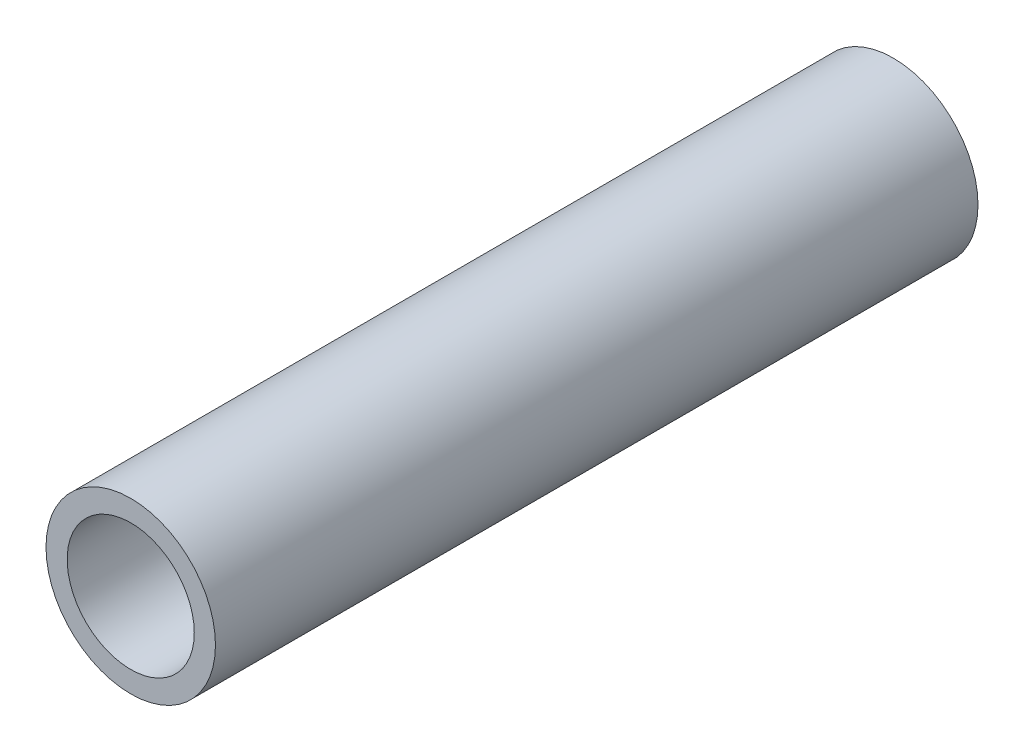
ISO-10303-21;
HEADER;
FILE_DESCRIPTION(('STEP AP214'),'2;1');
FILE_NAME('part.step','',(''),(''),'','','');
FILE_SCHEMA(('AUTOMOTIVE_DESIGN { 1 0 10303 214 1 1 1 1 }'));
ENDSEC;
DATA;
#1=APPLICATION_CONTEXT('core data for automotive mechanical design processes');
#2=APPLICATION_PROTOCOL_DEFINITION('international standard','automotive_design',2000,#1);
#3=PRODUCT_CONTEXT('',#1,'mechanical');
#4=PRODUCT('Part','Part','',(#3));
#5=PRODUCT_RELATED_PRODUCT_CATEGORY('part','',(#4));
#6=PRODUCT_DEFINITION_FORMATION('','',#4);
#7=PRODUCT_DEFINITION_CONTEXT('part definition',#1,'design');
#8=PRODUCT_DEFINITION('design','',#6,#7);
#9=PRODUCT_DEFINITION_SHAPE('','',#8);
#10=(LENGTH_UNIT() NAMED_UNIT(*) SI_UNIT(.MILLI.,.METRE.));
#11=(NAMED_UNIT(*) PLANE_ANGLE_UNIT() SI_UNIT($,.RADIAN.));
#12=(NAMED_UNIT(*) SI_UNIT($,.STERADIAN.) SOLID_ANGLE_UNIT());
#13=UNCERTAINTY_MEASURE_WITH_UNIT(LENGTH_MEASURE(1.E-05),#10,'distance_accuracy_value','');
#14=(GEOMETRIC_REPRESENTATION_CONTEXT(3) GLOBAL_UNCERTAINTY_ASSIGNED_CONTEXT((#13)) GLOBAL_UNIT_ASSIGNED_CONTEXT((#10,
#11,#12)) REPRESENTATION_CONTEXT('',''));
#15=CARTESIAN_POINT('',(0.,0.,0.));
#16=DIRECTION('',(0.,0.,1.));
#17=DIRECTION('',(1.,0.,0.));
#18=AXIS2_PLACEMENT_3D('',#15,#16,#17);
#19=CARTESIAN_POINT('',(0.,0.,180.));
#20=DIRECTION('',(0.,0.,-1.));
#21=DIRECTION('',(-1.,0.,0.));
#22=AXIS2_PLACEMENT_3D('',#19,#20,#21);
#23=CYLINDRICAL_SURFACE('',#22,20.);
#24=CARTESIAN_POINT('',(0.,0.,180.));
#25=DIRECTION('',(0.,0.,1.));
#26=DIRECTION('',(1.,0.,0.));
#27=AXIS2_PLACEMENT_3D('',#24,#25,#26);
#28=CIRCLE('',#27,20.);
#29=CARTESIAN_POINT('',(-20.,0.,180.));
#30=VERTEX_POINT('',#29);
#31=EDGE_CURVE('E10',#30,#30,#28,.T.);
#32=CARTESIAN_POINT('',(0.,0.,0.));
#33=DIRECTION('',(0.,0.,1.));
#34=DIRECTION('',(1.,0.,0.));
#35=AXIS2_PLACEMENT_3D('',#32,#33,#34);
#36=CIRCLE('',#35,20.);
#37=CARTESIAN_POINT('',(-20.,0.,0.));
#38=VERTEX_POINT('',#37);
#39=EDGE_CURVE('E34',#38,#38,#36,.T.);
#40=CARTESIAN_POINT('',(-20.,0.,180.));
#41=CARTESIAN_POINT('',(-20.,0.,178.125));
#42=CARTESIAN_POINT('',(-20.,0.,176.25));
#43=CARTESIAN_POINT('',(-20.,0.,172.5));
#44=CARTESIAN_POINT('',(-20.,0.,170.625));
#45=CARTESIAN_POINT('',(-20.,0.,166.875));
#46=CARTESIAN_POINT('',(-20.,0.,165.));
#47=CARTESIAN_POINT('',(-20.,0.,161.25));
#48=CARTESIAN_POINT('',(-20.,0.,159.375));
#49=CARTESIAN_POINT('',(-20.,0.,155.625));
#50=CARTESIAN_POINT('',(-20.,0.,153.75));
#51=CARTESIAN_POINT('',(-20.,0.,150.));
#52=CARTESIAN_POINT('',(-20.,0.,148.125));
#53=CARTESIAN_POINT('',(-20.,0.,144.375));
#54=CARTESIAN_POINT('',(-20.,0.,142.5));
#55=CARTESIAN_POINT('',(-20.,0.,138.75));
#56=CARTESIAN_POINT('',(-20.,0.,136.875));
#57=CARTESIAN_POINT('',(-20.,0.,133.125));
#58=CARTESIAN_POINT('',(-20.,0.,131.25));
#59=CARTESIAN_POINT('',(-20.,0.,127.5));
#60=CARTESIAN_POINT('',(-20.,0.,125.625));
#61=CARTESIAN_POINT('',(-20.,0.,121.875));
#62=CARTESIAN_POINT('',(-20.,0.,120.));
#63=CARTESIAN_POINT('',(-20.,0.,116.25));
#64=CARTESIAN_POINT('',(-20.,0.,114.375));
#65=CARTESIAN_POINT('',(-20.,0.,110.625));
#66=CARTESIAN_POINT('',(-20.,0.,108.75));
#67=CARTESIAN_POINT('',(-20.,0.,105.));
#68=CARTESIAN_POINT('',(-20.,0.,103.125));
#69=CARTESIAN_POINT('',(-20.,0.,99.375));
#70=CARTESIAN_POINT('',(-20.,0.,97.5));
#71=CARTESIAN_POINT('',(-20.,0.,93.75));
#72=CARTESIAN_POINT('',(-20.,0.,91.875));
#73=CARTESIAN_POINT('',(-20.,0.,88.125));
#74=CARTESIAN_POINT('',(-20.,0.,86.25));
#75=CARTESIAN_POINT('',(-20.,0.,82.5));
#76=CARTESIAN_POINT('',(-20.,0.,80.625));
#77=CARTESIAN_POINT('',(-20.,0.,76.875));
#78=CARTESIAN_POINT('',(-20.,0.,75.));
#79=CARTESIAN_POINT('',(-20.,0.,71.25));
#80=CARTESIAN_POINT('',(-20.,0.,69.375));
#81=CARTESIAN_POINT('',(-20.,0.,65.625));
#82=CARTESIAN_POINT('',(-20.,0.,63.75));
#83=CARTESIAN_POINT('',(-20.,0.,60.));
#84=CARTESIAN_POINT('',(-20.,0.,58.125));
#85=CARTESIAN_POINT('',(-20.,0.,54.375));
#86=CARTESIAN_POINT('',(-20.,0.,52.5));
#87=CARTESIAN_POINT('',(-20.,0.,48.75));
#88=CARTESIAN_POINT('',(-20.,0.,46.875));
#89=CARTESIAN_POINT('',(-20.,0.,43.125));
#90=CARTESIAN_POINT('',(-20.,0.,41.25));
#91=CARTESIAN_POINT('',(-20.,0.,37.5));
#92=CARTESIAN_POINT('',(-20.,0.,35.625));
#93=CARTESIAN_POINT('',(-20.,0.,31.875));
#94=CARTESIAN_POINT('',(-20.,0.,30.));
#95=CARTESIAN_POINT('',(-20.,0.,26.25));
#96=CARTESIAN_POINT('',(-20.,0.,24.375));
#97=CARTESIAN_POINT('',(-20.,0.,20.625));
#98=CARTESIAN_POINT('',(-20.,0.,18.75));
#99=CARTESIAN_POINT('',(-20.,0.,15.));
#100=CARTESIAN_POINT('',(-20.,0.,13.125));
#101=CARTESIAN_POINT('',(-20.,0.,9.37499999999998));
#102=CARTESIAN_POINT('',(-20.,0.,7.49999999999997));
#103=CARTESIAN_POINT('',(-20.,0.,3.74999999999997));
#104=CARTESIAN_POINT('',(-20.,0.,1.87499999999997));
#105=CARTESIAN_POINT('',(-20.,0.,0.));
#106=B_SPLINE_CURVE_WITH_KNOTS('',3,(#40,#41,#42,#43,#44,#45,#46,#47,#48,#49,#50,#51,#52,#53,
#54,#55,#56,#57,#58,#59,#60,#61,#62,#63,#64,#65,#66,#67,#68,#69,#70,#71,#72,#73,#74,#75,#76,#77,
#78,#79,#80,#81,#82,#83,#84,#85,#86,#87,#88,#89,#90,#91,#92,#93,#94,#95,#96,#97,#98,#99,#100,
#101,#102,#103,#104,#105),.UNSPECIFIED.,.F.,.F.,(4,2,2,2,2,2,2,2,2,2,2,2,2,2,2,2,2,2,2,2,2,2,2,
2,2,2,2,2,2,2,2,2,4),(0.,5.62500000000002,11.25,16.875,22.5,28.125,33.75,39.375,45.,50.625,
56.25,61.875,67.5,73.125,78.75,84.375,90.,95.625,101.25,106.875,112.5,118.125,123.75,129.375,
135.,140.625,146.25,151.875,157.5,163.125,168.75,174.375,180.),.UNSPECIFIED.);
#107=EDGE_CURVE('BSEAM31',#30,#38,#106,.T.);
#108=ORIENTED_EDGE('',*,*,#31,.F.);
#109=ORIENTED_EDGE('',*,*,#39,.T.);
#110=ORIENTED_EDGE('',*,*,#107,.T.);
#111=ORIENTED_EDGE('',*,*,#107,.F.);
#112=EDGE_LOOP('',(#108,#110,#109,#111));
#113=FACE_BOUND('',#112,.T.);
#114=ADVANCED_FACE('F31',(#113),#23,.T.);
#115=CARTESIAN_POINT('',(0.,0.,180.));
#116=DIRECTION('',(0.,0.,1.));
#117=DIRECTION('',(1.,0.,0.));
#118=AXIS2_PLACEMENT_3D('',#115,#116,#117);
#119=PLANE('',#118);
#120=CARTESIAN_POINT('',(0.,0.,180.));
#121=DIRECTION('',(0.,0.,1.));
#122=DIRECTION('',(1.,0.,0.));
#123=AXIS2_PLACEMENT_3D('',#120,#121,#122);
#124=CIRCLE('',#123,15.);
#125=CARTESIAN_POINT('',(15.,0.,180.));
#126=VERTEX_POINT('',#125);
#127=EDGE_CURVE('E43',#126,#126,#124,.T.);
#128=ORIENTED_EDGE('',*,*,#127,.F.);
#129=EDGE_LOOP('',(#128));
#130=FACE_BOUND('',#129,.T.);
#131=ORIENTED_EDGE('',*,*,#31,.T.);
#132=EDGE_LOOP('',(#131));
#133=FACE_BOUND('',#132,.T.);
#134=ADVANCED_FACE('F58',(#130,#133),#119,.T.);
#135=CARTESIAN_POINT('',(0.,0.,0.));
#136=DIRECTION('',(0.,0.,1.));
#137=DIRECTION('',(1.,0.,0.));
#138=AXIS2_PLACEMENT_3D('',#135,#136,#137);
#139=PLANE('',#138);
#140=CARTESIAN_POINT('',(0.,0.,0.));
#141=DIRECTION('',(0.,0.,1.));
#142=DIRECTION('',(1.,0.,0.));
#143=AXIS2_PLACEMENT_3D('',#140,#141,#142);
#144=CIRCLE('',#143,15.);
#145=CARTESIAN_POINT('',(15.,0.,0.));
#146=VERTEX_POINT('',#145);
#147=EDGE_CURVE('E41',#146,#146,#144,.T.);
#148=ORIENTED_EDGE('',*,*,#147,.T.);
#149=EDGE_LOOP('',(#148));
#150=FACE_BOUND('',#149,.T.);
#151=ORIENTED_EDGE('',*,*,#39,.F.);
#152=EDGE_LOOP('',(#151));
#153=FACE_BOUND('',#152,.T.);
#154=ADVANCED_FACE('F49',(#150,#153),#139,.F.);
#155=CARTESIAN_POINT('',(0.,0.,0.));
#156=DIRECTION('',(0.,0.,1.));
#157=DIRECTION('',(1.,0.,0.));
#158=AXIS2_PLACEMENT_3D('',#155,#156,#157);
#159=CYLINDRICAL_SURFACE('',#158,15.);
#160=CARTESIAN_POINT('',(15.,0.,0.));
#161=CARTESIAN_POINT('',(15.,0.,1.875));
#162=CARTESIAN_POINT('',(15.,0.,3.75));
#163=CARTESIAN_POINT('',(15.,0.,7.5));
#164=CARTESIAN_POINT('',(15.,0.,9.375));
#165=CARTESIAN_POINT('',(15.,0.,13.125));
#166=CARTESIAN_POINT('',(15.,0.,15.));
#167=CARTESIAN_POINT('',(15.,0.,18.75));
#168=CARTESIAN_POINT('',(15.,0.,20.625));
#169=CARTESIAN_POINT('',(15.,0.,24.375));
#170=CARTESIAN_POINT('',(15.,0.,26.25));
#171=CARTESIAN_POINT('',(15.,0.,30.));
#172=CARTESIAN_POINT('',(15.,0.,31.875));
#173=CARTESIAN_POINT('',(15.,0.,35.625));
#174=CARTESIAN_POINT('',(15.,0.,37.5));
#175=CARTESIAN_POINT('',(15.,0.,41.25));
#176=CARTESIAN_POINT('',(15.,0.,43.125));
#177=CARTESIAN_POINT('',(15.,0.,46.875));
#178=CARTESIAN_POINT('',(15.,0.,48.75));
#179=CARTESIAN_POINT('',(15.,0.,52.5));
#180=CARTESIAN_POINT('',(15.,0.,54.375));
#181=CARTESIAN_POINT('',(15.,0.,58.125));
#182=CARTESIAN_POINT('',(15.,0.,60.));
#183=CARTESIAN_POINT('',(15.,0.,63.75));
#184=CARTESIAN_POINT('',(15.,0.,65.625));
#185=CARTESIAN_POINT('',(15.,0.,69.375));
#186=CARTESIAN_POINT('',(15.,0.,71.25));
#187=CARTESIAN_POINT('',(15.,0.,75.));
#188=CARTESIAN_POINT('',(15.,0.,76.875));
#189=CARTESIAN_POINT('',(15.,0.,80.625));
#190=CARTESIAN_POINT('',(15.,0.,82.5));
#191=CARTESIAN_POINT('',(15.,0.,86.25));
#192=CARTESIAN_POINT('',(15.,0.,88.125));
#193=CARTESIAN_POINT('',(15.,0.,91.875));
#194=CARTESIAN_POINT('',(15.,0.,93.75));
#195=CARTESIAN_POINT('',(15.,0.,97.5));
#196=CARTESIAN_POINT('',(15.,0.,99.375));
#197=CARTESIAN_POINT('',(15.,0.,103.125));
#198=CARTESIAN_POINT('',(15.,0.,105.));
#199=CARTESIAN_POINT('',(15.,0.,108.75));
#200=CARTESIAN_POINT('',(15.,0.,110.625));
#201=CARTESIAN_POINT('',(15.,0.,114.375));
#202=CARTESIAN_POINT('',(15.,0.,116.25));
#203=CARTESIAN_POINT('',(15.,0.,120.));
#204=CARTESIAN_POINT('',(15.,0.,121.875));
#205=CARTESIAN_POINT('',(15.,0.,125.625));
#206=CARTESIAN_POINT('',(15.,0.,127.5));
#207=CARTESIAN_POINT('',(15.,0.,131.25));
#208=CARTESIAN_POINT('',(15.,0.,133.125));
#209=CARTESIAN_POINT('',(15.,0.,136.875));
#210=CARTESIAN_POINT('',(15.,0.,138.75));
#211=CARTESIAN_POINT('',(15.,0.,142.5));
#212=CARTESIAN_POINT('',(15.,0.,144.375));
#213=CARTESIAN_POINT('',(15.,0.,148.125));
#214=CARTESIAN_POINT('',(15.,0.,150.));
#215=CARTESIAN_POINT('',(15.,0.,153.75));
#216=CARTESIAN_POINT('',(15.,0.,155.625));
#217=CARTESIAN_POINT('',(15.,0.,159.375));
#218=CARTESIAN_POINT('',(15.,0.,161.25));
#219=CARTESIAN_POINT('',(15.,0.,165.));
#220=CARTESIAN_POINT('',(15.,0.,166.875));
#221=CARTESIAN_POINT('',(15.,0.,170.625));
#222=CARTESIAN_POINT('',(15.,0.,172.5));
#223=CARTESIAN_POINT('',(15.,0.,176.25));
#224=CARTESIAN_POINT('',(15.,0.,178.125));
#225=CARTESIAN_POINT('',(15.,0.,180.));
#226=B_SPLINE_CURVE_WITH_KNOTS('',3,(#160,#161,#162,#163,#164,#165,#166,#167,#168,#169,#170,
#171,#172,#173,#174,#175,#176,#177,#178,#179,#180,#181,#182,#183,#184,#185,#186,#187,#188,#189,
#190,#191,#192,#193,#194,#195,#196,#197,#198,#199,#200,#201,#202,#203,#204,#205,#206,#207,#208,
#209,#210,#211,#212,#213,#214,#215,#216,#217,#218,#219,#220,#221,#222,#223,#224,#225),
.UNSPECIFIED.,.F.,.F.,(4,2,2,2,2,2,2,2,2,2,2,2,2,2,2,2,2,2,2,2,2,2,2,2,2,2,2,2,2,2,2,2,4),(0.,
5.625,11.25,16.875,22.5,28.125,33.75,39.375,45.,50.625,56.25,61.875,67.5,73.125,78.75,84.375,
90.,95.625,101.25,106.875,112.5,118.125,123.75,129.375,135.,140.625,146.25,151.875,157.5,
163.125,168.75,174.375,180.),.UNSPECIFIED.);
#227=EDGE_CURVE('BSEAM52',#146,#126,#226,.T.);
#228=ORIENTED_EDGE('',*,*,#147,.F.);
#229=ORIENTED_EDGE('',*,*,#127,.T.);
#230=ORIENTED_EDGE('',*,*,#227,.T.);
#231=ORIENTED_EDGE('',*,*,#227,.F.);
#232=EDGE_LOOP('',(#228,#230,#229,#231));
#233=FACE_BOUND('',#232,.T.);
#234=ADVANCED_FACE('F52',(#233),#159,.F.);
#235=CLOSED_SHELL('',(#114,#134,#154,#234));
#236=MANIFOLD_SOLID_BREP('B2',#235);
#237=ADVANCED_BREP_SHAPE_REPRESENTATION('',(#18,#236),#14);
#238=SHAPE_DEFINITION_REPRESENTATION(#9,#237);
ENDSEC;
END-ISO-10303-21;
